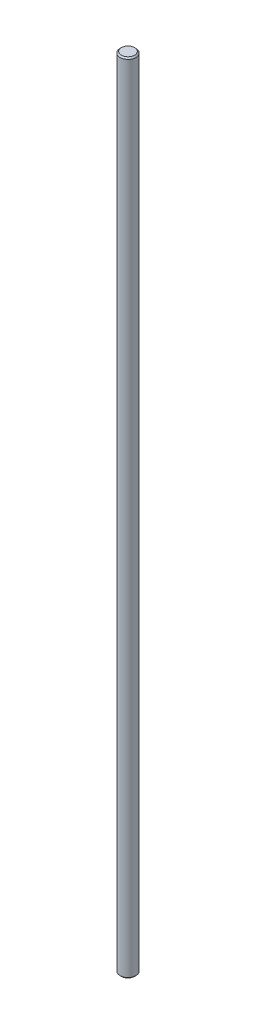
ISO-10303-21;
HEADER;
FILE_DESCRIPTION(('STEP AP214'),'2;1');
FILE_NAME('part.step','',(''),(''),'','','');
FILE_SCHEMA(('AUTOMOTIVE_DESIGN { 1 0 10303 214 1 1 1 1 }'));
ENDSEC;
DATA;
#1=APPLICATION_CONTEXT('core data for automotive mechanical design processes');
#2=APPLICATION_PROTOCOL_DEFINITION('international standard','automotive_design',2000,#1);
#3=PRODUCT_CONTEXT('',#1,'mechanical');
#4=PRODUCT('Part','Part','',(#3));
#5=PRODUCT_RELATED_PRODUCT_CATEGORY('part','',(#4));
#6=PRODUCT_DEFINITION_FORMATION('','',#4);
#7=PRODUCT_DEFINITION_CONTEXT('part definition',#1,'design');
#8=PRODUCT_DEFINITION('design','',#6,#7);
#9=PRODUCT_DEFINITION_SHAPE('','',#8);
#10=(LENGTH_UNIT() NAMED_UNIT(*) SI_UNIT(.MILLI.,.METRE.));
#11=(NAMED_UNIT(*) PLANE_ANGLE_UNIT() SI_UNIT($,.RADIAN.));
#12=(NAMED_UNIT(*) SI_UNIT($,.STERADIAN.) SOLID_ANGLE_UNIT());
#13=UNCERTAINTY_MEASURE_WITH_UNIT(LENGTH_MEASURE(1.E-05),#10,'distance_accuracy_value','');
#14=(GEOMETRIC_REPRESENTATION_CONTEXT(3) GLOBAL_UNCERTAINTY_ASSIGNED_CONTEXT((#13)) GLOBAL_UNIT_ASSIGNED_CONTEXT((#10,
#11,#12)) REPRESENTATION_CONTEXT('',''));
#15=CARTESIAN_POINT('',(0.,0.,0.));
#16=DIRECTION('',(0.,0.,1.));
#17=DIRECTION('',(1.,0.,0.));
#18=AXIS2_PLACEMENT_3D('',#15,#16,#17);
#19=CARTESIAN_POINT('',(0.,302.,0.));
#20=DIRECTION('',(0.,-1.,0.));
#21=DIRECTION('',(0.,0.,-1.));
#22=AXIS2_PLACEMENT_3D('',#19,#20,#21);
#23=CYLINDRICAL_SURFACE('',#22,3.);
#24=CARTESIAN_POINT('',(0.,301.5,0.));
#25=DIRECTION('',(0.,1.,0.));
#26=DIRECTION('',(0.,0.,1.));
#27=AXIS2_PLACEMENT_3D('',#24,#25,#26);
#28=CIRCLE('',#27,3.);
#29=CARTESIAN_POINT('',(0.,301.5,3.));
#30=VERTEX_POINT('',#29);
#31=EDGE_CURVE('E10',#30,#30,#28,.F.);
#32=ORIENTED_EDGE('',*,*,#31,.T.);
#33=EDGE_LOOP('',(#32));
#34=FACE_BOUND('',#33,.T.);
#35=CARTESIAN_POINT('',(0.,0.499999999999889,0.));
#36=DIRECTION('',(0.,1.,0.));
#37=DIRECTION('',(0.,0.,1.));
#38=AXIS2_PLACEMENT_3D('',#35,#36,#37);
#39=CIRCLE('',#38,3.);
#40=CARTESIAN_POINT('',(0.,0.499999999999889,3.));
#41=VERTEX_POINT('',#40);
#42=EDGE_CURVE('E46',#41,#41,#39,.T.);
#43=ORIENTED_EDGE('',*,*,#42,.T.);
#44=EDGE_LOOP('',(#43));
#45=FACE_BOUND('',#44,.T.);
#46=ADVANCED_FACE('F31',(#34,#45),#23,.T.);
#47=CARTESIAN_POINT('',(0.,302.,0.));
#48=DIRECTION('',(0.,1.,0.));
#49=DIRECTION('',(0.,0.,1.));
#50=AXIS2_PLACEMENT_3D('',#47,#48,#49);
#51=PLANE('',#50);
#52=CARTESIAN_POINT('',(0.,302.,0.));
#53=DIRECTION('',(0.,1.,0.));
#54=DIRECTION('',(0.,0.,1.));
#55=AXIS2_PLACEMENT_3D('',#52,#53,#54);
#56=CIRCLE('',#55,2.5);
#57=CARTESIAN_POINT('',(0.,302.,2.5));
#58=VERTEX_POINT('',#57);
#59=EDGE_CURVE('E38',#58,#58,#56,.T.);
#60=ORIENTED_EDGE('',*,*,#59,.T.);
#61=EDGE_LOOP('',(#60));
#62=FACE_BOUND('',#61,.T.);
#63=ADVANCED_FACE('F62',(#62),#51,.T.);
#64=CARTESIAN_POINT('',(0.,0.,0.));
#65=DIRECTION('',(0.,1.,0.));
#66=DIRECTION('',(0.,0.,1.));
#67=AXIS2_PLACEMENT_3D('',#64,#65,#66);
#68=PLANE('',#67);
#69=CARTESIAN_POINT('',(0.,0.,0.));
#70=DIRECTION('',(0.,1.,0.));
#71=DIRECTION('',(0.,0.,1.));
#72=AXIS2_PLACEMENT_3D('',#69,#70,#71);
#73=CIRCLE('',#72,2.50000000000009);
#74=CARTESIAN_POINT('',(0.,0.,2.50000000000009));
#75=VERTEX_POINT('',#74);
#76=EDGE_CURVE('E42',#75,#75,#73,.F.);
#77=ORIENTED_EDGE('',*,*,#76,.T.);
#78=EDGE_LOOP('',(#77));
#79=FACE_BOUND('',#78,.T.);
#80=ADVANCED_FACE('F55',(#79),#68,.F.);
#81=CARTESIAN_POINT('',(0.,0.499999999999889,0.));
#82=DIRECTION('',(0.,1.,0.));
#83=DIRECTION('',(0.,0.,1.));
#84=AXIS2_PLACEMENT_3D('',#81,#82,#83);
#85=CONICAL_SURFACE('',#84,3.,0.785398163397473);
#86=ORIENTED_EDGE('',*,*,#76,.F.);
#87=EDGE_LOOP('',(#86));
#88=FACE_BOUND('',#87,.T.);
#89=ORIENTED_EDGE('',*,*,#42,.F.);
#90=EDGE_LOOP('',(#89));
#91=FACE_BOUND('',#90,.T.);
#92=ADVANCED_FACE('F53',(#88,#91),#85,.T.);
#93=CARTESIAN_POINT('',(0.,302.,0.));
#94=DIRECTION('',(0.,-1.,0.));
#95=DIRECTION('',(0.,0.,-1.));
#96=AXIS2_PLACEMENT_3D('',#93,#94,#95);
#97=CONICAL_SURFACE('',#96,2.5,0.785398163397502);
#98=ORIENTED_EDGE('',*,*,#31,.F.);
#99=EDGE_LOOP('',(#98));
#100=FACE_BOUND('',#99,.T.);
#101=ORIENTED_EDGE('',*,*,#59,.F.);
#102=EDGE_LOOP('',(#101));
#103=FACE_BOUND('',#102,.T.);
#104=ADVANCED_FACE('F33',(#100,#103),#97,.T.);
#105=CLOSED_SHELL('',(#46,#63,#80,#92,#104));
#106=MANIFOLD_SOLID_BREP('B2',#105);
#107=ADVANCED_BREP_SHAPE_REPRESENTATION('',(#18,#106),#14);
#108=SHAPE_DEFINITION_REPRESENTATION(#9,#107);
ENDSEC;
END-ISO-10303-21;
